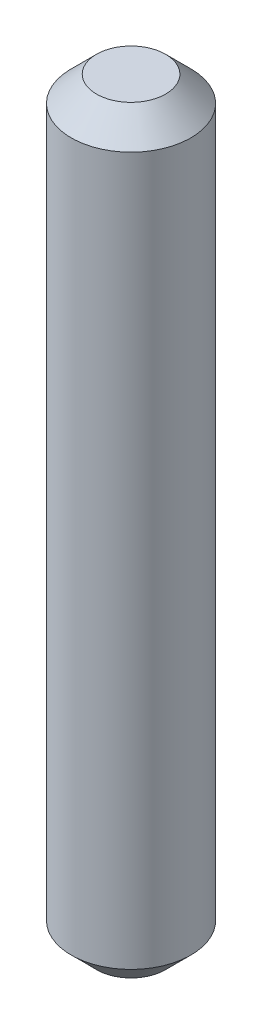
ISO-10303-21;
HEADER;
FILE_DESCRIPTION(('STEP AP214'),'2;1');
FILE_NAME('part.step','',(''),(''),'','','');
FILE_SCHEMA(('AUTOMOTIVE_DESIGN { 1 0 10303 214 1 1 1 1 }'));
ENDSEC;
DATA;
#1=APPLICATION_CONTEXT('core data for automotive mechanical design processes');
#2=APPLICATION_PROTOCOL_DEFINITION('international standard','automotive_design',2000,#1);
#3=PRODUCT_CONTEXT('',#1,'mechanical');
#4=PRODUCT('Part','Part','',(#3));
#5=PRODUCT_RELATED_PRODUCT_CATEGORY('part','',(#4));
#6=PRODUCT_DEFINITION_FORMATION('','',#4);
#7=PRODUCT_DEFINITION_CONTEXT('part definition',#1,'design');
#8=PRODUCT_DEFINITION('design','',#6,#7);
#9=PRODUCT_DEFINITION_SHAPE('','',#8);
#10=(LENGTH_UNIT() NAMED_UNIT(*) SI_UNIT(.MILLI.,.METRE.));
#11=(NAMED_UNIT(*) PLANE_ANGLE_UNIT() SI_UNIT($,.RADIAN.));
#12=(NAMED_UNIT(*) SI_UNIT($,.STERADIAN.) SOLID_ANGLE_UNIT());
#13=UNCERTAINTY_MEASURE_WITH_UNIT(LENGTH_MEASURE(1.E-05),#10,'distance_accuracy_value','');
#14=(GEOMETRIC_REPRESENTATION_CONTEXT(3) GLOBAL_UNCERTAINTY_ASSIGNED_CONTEXT((#13)) GLOBAL_UNIT_ASSIGNED_CONTEXT((#10,
#11,#12)) REPRESENTATION_CONTEXT('',''));
#15=CARTESIAN_POINT('',(0.,0.,0.));
#16=DIRECTION('',(0.,0.,1.));
#17=DIRECTION('',(1.,0.,0.));
#18=AXIS2_PLACEMENT_3D('',#15,#16,#17);
#19=CARTESIAN_POINT('',(0.520700000000845,1.49880108324396E-12,2.63677968348475E-13));
#20=DIRECTION('',(0.,-1.,0.));
#21=DIRECTION('',(0.,0.,-1.00000000000076));
#22=AXIS2_PLACEMENT_3D('',#19,#20,#21);
#23=PLANE('',#22);
#24=CARTESIAN_POINT('',(0.,0.,0.));
#25=DIRECTION('',(0.,-1.,0.));
#26=DIRECTION('',(0.,0.,-1.00000000000076));
#27=AXIS2_PLACEMENT_3D('',#24,#25,#26);
#28=CIRCLE('',#27,0.5207);
#29=CARTESIAN_POINT('',(0.,0.,-0.520700000000396));
#30=VERTEX_POINT('',#29);
#31=EDGE_CURVE('E46',#30,#30,#28,.T.);
#32=ORIENTED_EDGE('',*,*,#31,.T.);
#33=EDGE_LOOP('',(#32));
#34=FACE_BOUND('',#33,.T.);
#35=ADVANCED_FACE('F32',(#34),#23,.T.);
#36=CARTESIAN_POINT('',(2.37310171513627E-12,11.4299999999999,-2.42861286636753E-12));
#37=DIRECTION('',(0.,1.,0.));
#38=DIRECTION('',(0.,0.,1.00000000000076));
#39=AXIS2_PLACEMENT_3D('',#36,#37,#38);
#40=PLANE('',#39);
#41=CARTESIAN_POINT('',(2.37310171513627E-12,11.4299999999999,-2.42861286636753E-12));
#42=DIRECTION('',(0.,-1.,0.));
#43=DIRECTION('',(0.,0.,-1.00000000000076));
#44=AXIS2_PLACEMENT_3D('',#41,#42,#43);
#45=CIRCLE('',#44,0.520700000000001);
#46=CARTESIAN_POINT('',(2.37219844462233E-12,11.4299999999999,-0.520700000002825));
#47=VERTEX_POINT('',#46);
#48=EDGE_CURVE('E10',#47,#47,#45,.T.);
#49=ORIENTED_EDGE('',*,*,#48,.F.);
#50=EDGE_LOOP('',(#49));
#51=FACE_BOUND('',#50,.T.);
#52=ADVANCED_FACE('F64',(#51),#40,.T.);
#53=CARTESIAN_POINT('',(-7.63278329429795E-13,11.0489999999999,-3.40005801291454E-13));
#54=DIRECTION('',(0.,-1.,0.));
#55=DIRECTION('',(0.,0.,-1.00000000000076));
#56=AXIS2_PLACEMENT_3D('',#53,#54,#55);
#57=CONICAL_SURFACE('',#56,0.9017,0.785398163397448);
#58=ORIENTED_EDGE('',*,*,#48,.T.);
#59=EDGE_LOOP('',(#58));
#60=FACE_BOUND('',#59,.T.);
#61=CARTESIAN_POINT('',(-7.63278329429795E-13,11.0489999999999,-3.40005801291454E-13));
#62=DIRECTION('',(0.,-1.,0.));
#63=DIRECTION('',(0.,0.,-1.00000000000076));
#64=AXIS2_PLACEMENT_3D('',#61,#62,#63);
#65=CIRCLE('',#64,0.9017);
#66=CARTESIAN_POINT('',(-7.64842529588083E-13,11.0489999999999,-0.901700000001025));
#67=VERTEX_POINT('',#66);
#68=EDGE_CURVE('E38',#67,#67,#65,.T.);
#69=ORIENTED_EDGE('',*,*,#68,.F.);
#70=EDGE_LOOP('',(#69));
#71=FACE_BOUND('',#70,.T.);
#72=ADVANCED_FACE('F61',(#60,#71),#57,.T.);
#73=CARTESIAN_POINT('',(0.,0.,0.));
#74=DIRECTION('',(0.,-1.,0.));
#75=DIRECTION('',(0.,0.,-1.00000000000076));
#76=AXIS2_PLACEMENT_3D('',#73,#74,#75);
#77=CYLINDRICAL_SURFACE('',#76,0.9017);
#78=ORIENTED_EDGE('',*,*,#68,.T.);
#79=EDGE_LOOP('',(#78));
#80=FACE_BOUND('',#79,.T.);
#81=CARTESIAN_POINT('',(-6.93889390390723E-13,0.380999999999999,4.57966997657877E-13));
#82=DIRECTION('',(0.,-1.,0.));
#83=DIRECTION('',(0.,0.,-1.00000000000076));
#84=AXIS2_PLACEMENT_3D('',#81,#82,#83);
#85=CIRCLE('',#84,0.9017);
#86=CARTESIAN_POINT('',(-6.95453590549011E-13,0.380999999999999,-0.901700000000227));
#87=VERTEX_POINT('',#86);
#88=EDGE_CURVE('E42',#87,#87,#85,.T.);
#89=ORIENTED_EDGE('',*,*,#88,.F.);
#90=EDGE_LOOP('',(#89));
#91=FACE_BOUND('',#90,.T.);
#92=ADVANCED_FACE('F55',(#80,#91),#77,.T.);
#93=CARTESIAN_POINT('',(0.,0.,0.));
#94=DIRECTION('',(0.,1.,0.));
#95=DIRECTION('',(0.,0.,1.00000000000076));
#96=AXIS2_PLACEMENT_3D('',#93,#94,#95);
#97=CONICAL_SURFACE('',#96,0.5207,0.785398163397449);
#98=ORIENTED_EDGE('',*,*,#88,.T.);
#99=EDGE_LOOP('',(#98));
#100=FACE_BOUND('',#99,.T.);
#101=ORIENTED_EDGE('',*,*,#31,.F.);
#102=EDGE_LOOP('',(#101));
#103=FACE_BOUND('',#102,.T.);
#104=ADVANCED_FACE('F53',(#100,#103),#97,.T.);
#105=CLOSED_SHELL('',(#35,#52,#72,#92,#104));
#106=MANIFOLD_SOLID_BREP('B2',#105);
#107=ADVANCED_BREP_SHAPE_REPRESENTATION('',(#18,#106),#14);
#108=SHAPE_DEFINITION_REPRESENTATION(#9,#107);
ENDSEC;
END-ISO-10303-21;
